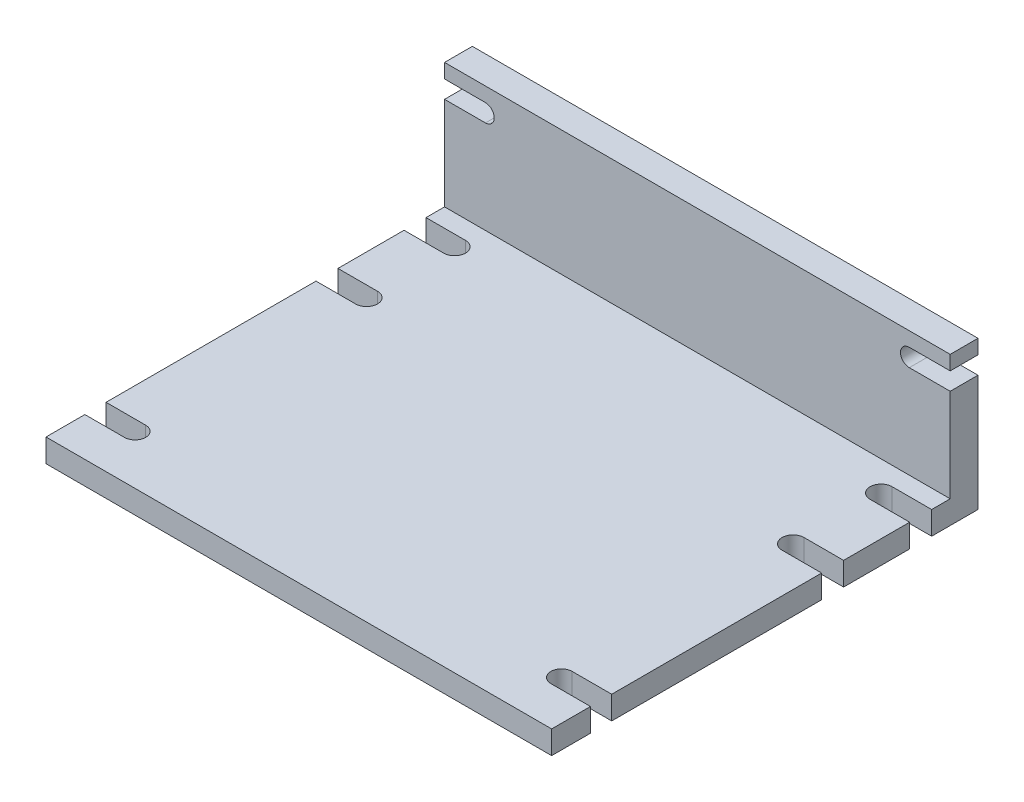
ISO-10303-21;
HEADER;
FILE_DESCRIPTION(('STEP AP214'),'2;1');
FILE_NAME('part.step','',(''),(''),'','','');
FILE_SCHEMA(('AUTOMOTIVE_DESIGN { 1 0 10303 214 1 1 1 1 }'));
ENDSEC;
DATA;
#1=APPLICATION_CONTEXT('core data for automotive mechanical design processes');
#2=APPLICATION_PROTOCOL_DEFINITION('international standard','automotive_design',2000,#1);
#3=PRODUCT_CONTEXT('',#1,'mechanical');
#4=PRODUCT('Part','Part','',(#3));
#5=PRODUCT_RELATED_PRODUCT_CATEGORY('part','',(#4));
#6=PRODUCT_DEFINITION_FORMATION('','',#4);
#7=PRODUCT_DEFINITION_CONTEXT('part definition',#1,'design');
#8=PRODUCT_DEFINITION('design','',#6,#7);
#9=PRODUCT_DEFINITION_SHAPE('','',#8);
#10=(LENGTH_UNIT() NAMED_UNIT(*) SI_UNIT(.MILLI.,.METRE.));
#11=(NAMED_UNIT(*) PLANE_ANGLE_UNIT() SI_UNIT($,.RADIAN.));
#12=(NAMED_UNIT(*) SI_UNIT($,.STERADIAN.) SOLID_ANGLE_UNIT());
#13=UNCERTAINTY_MEASURE_WITH_UNIT(LENGTH_MEASURE(1.E-05),#10,'distance_accuracy_value','');
#14=(GEOMETRIC_REPRESENTATION_CONTEXT(3) GLOBAL_UNCERTAINTY_ASSIGNED_CONTEXT((#13)) GLOBAL_UNIT_ASSIGNED_CONTEXT((#10,
#11,#12)) REPRESENTATION_CONTEXT('',''));
#15=CARTESIAN_POINT('',(0.,0.,0.));
#16=DIRECTION('',(0.,0.,1.));
#17=DIRECTION('',(1.,0.,0.));
#18=AXIS2_PLACEMENT_3D('',#15,#16,#17);
#19=CARTESIAN_POINT('',(-54.555,32.,46.));
#20=DIRECTION('',(1.,0.,0.));
#21=DIRECTION('',(0.,0.,-1.));
#22=AXIS2_PLACEMENT_3D('',#19,#20,#21);
#23=PLANE('',#22);
#24=DIRECTION('',(0.,0.,-1.));
#25=VECTOR('',#24,1.);
#26=CARTESIAN_POINT('',(-54.555,5.,46.));
#27=LINE('',#26,#25);
#28=CARTESIAN_POINT('',(-54.555,5.,46.));
#29=VERTEX_POINT('',#28);
#30=CARTESIAN_POINT('',(-54.555,5.,37.6156076465675));
#31=VERTEX_POINT('',#30);
#32=EDGE_CURVE('E499',#29,#31,#27,.T.);
#33=ORIENTED_EDGE('',*,*,#32,.T.);
#34=DIRECTION('',(0.,1.,0.));
#35=VECTOR('',#34,1.);
#36=CARTESIAN_POINT('',(-54.555,0.,37.6156076465675));
#37=LINE('',#36,#35);
#38=CARTESIAN_POINT('',(-54.555,0.,37.6156076465675));
#39=VERTEX_POINT('',#38);
#40=EDGE_CURVE('E329',#39,#31,#37,.T.);
#41=ORIENTED_EDGE('',*,*,#40,.F.);
#42=DIRECTION('',(0.,0.,1.));
#43=VECTOR('',#42,1.);
#44=CARTESIAN_POINT('',(-54.555,0.,46.));
#45=LINE('',#44,#43);
#46=CARTESIAN_POINT('',(-54.555,0.,46.));
#47=VERTEX_POINT('',#46);
#48=EDGE_CURVE('E520',#39,#47,#45,.T.);
#49=ORIENTED_EDGE('',*,*,#48,.T.);
#50=DIRECTION('',(0.,-1.,0.));
#51=VECTOR('',#50,1.);
#52=CARTESIAN_POINT('',(-54.555,32.,46.));
#53=LINE('',#52,#51);
#54=EDGE_CURVE('E11',#29,#47,#53,.T.);
#55=ORIENTED_EDGE('',*,*,#54,.F.);
#56=EDGE_LOOP('',(#33,#41,#49,#55));
#57=FACE_BOUND('',#56,.T.);
#58=ADVANCED_FACE('F41',(#57),#23,.F.);
#59=CARTESIAN_POINT('',(-54.555,0.,-12.26));
#60=VERTEX_POINT('',#59);
#61=CARTESIAN_POINT('',(-54.555,0.,33.0378617913331));
#62=VERTEX_POINT('',#61);
#63=EDGE_CURVE('E576',#60,#62,#45,.T.);
#64=ORIENTED_EDGE('',*,*,#63,.T.);
#65=DIRECTION('',(0.,1.,0.));
#66=VECTOR('',#65,1.);
#67=CARTESIAN_POINT('',(-54.555,0.,33.0378617913331));
#68=LINE('',#67,#66);
#69=CARTESIAN_POINT('',(-54.555,5.,33.0378617913331));
#70=VERTEX_POINT('',#69);
#71=EDGE_CURVE('E326',#62,#70,#68,.T.);
#72=ORIENTED_EDGE('',*,*,#71,.T.);
#73=CARTESIAN_POINT('',(-54.555,5.,-12.26));
#74=VERTEX_POINT('',#73);
#75=EDGE_CURVE('E503',#70,#74,#27,.T.);
#76=ORIENTED_EDGE('',*,*,#75,.T.);
#77=DIRECTION('',(0.,1.,0.));
#78=VECTOR('',#77,1.);
#79=CARTESIAN_POINT('',(-54.555,0.,-12.26));
#80=LINE('',#79,#78);
#81=EDGE_CURVE('E295',#60,#74,#80,.T.);
#82=ORIENTED_EDGE('',*,*,#81,.F.);
#83=EDGE_LOOP('',(#64,#72,#76,#82));
#84=FACE_BOUND('',#83,.T.);
#85=ADVANCED_FACE('F606',(#84),#23,.F.);
#86=CARTESIAN_POINT('',(-54.555,0.,-31.26));
#87=VERTEX_POINT('',#86);
#88=CARTESIAN_POINT('',(-54.555,0.,-17.));
#89=VERTEX_POINT('',#88);
#90=EDGE_CURVE('E538',#87,#89,#45,.T.);
#91=ORIENTED_EDGE('',*,*,#90,.T.);
#92=DIRECTION('',(0.,1.,0.));
#93=VECTOR('',#92,1.);
#94=CARTESIAN_POINT('',(-54.555,0.,-17.));
#95=LINE('',#94,#93);
#96=CARTESIAN_POINT('',(-54.555,5.,-17.));
#97=VERTEX_POINT('',#96);
#98=EDGE_CURVE('E587',#89,#97,#95,.T.);
#99=ORIENTED_EDGE('',*,*,#98,.T.);
#100=CARTESIAN_POINT('',(-54.555,5.,-31.26));
#101=VERTEX_POINT('',#100);
#102=EDGE_CURVE('E902',#97,#101,#27,.T.);
#103=ORIENTED_EDGE('',*,*,#102,.T.);
#104=DIRECTION('',(0.,1.,0.));
#105=VECTOR('',#104,1.);
#106=CARTESIAN_POINT('',(-54.555,0.,-31.26));
#107=LINE('',#106,#105);
#108=EDGE_CURVE('E440',#87,#101,#107,.T.);
#109=ORIENTED_EDGE('',*,*,#108,.F.);
#110=EDGE_LOOP('',(#91,#99,#103,#109));
#111=FACE_BOUND('',#110,.T.);
#112=ADVANCED_FACE('F585',(#111),#23,.F.);
#113=CARTESIAN_POINT('',(54.555,32.,46.));
#114=DIRECTION('',(-1.,0.,0.));
#115=DIRECTION('',(0.,0.,1.));
#116=AXIS2_PLACEMENT_3D('',#113,#114,#115);
#117=PLANE('',#116);
#118=DIRECTION('',(0.,0.,-1.));
#119=VECTOR('',#118,1.);
#120=CARTESIAN_POINT('',(54.555,0.,46.));
#121=LINE('',#120,#119);
#122=CARTESIAN_POINT('',(54.555,0.,-17.));
#123=VERTEX_POINT('',#122);
#124=CARTESIAN_POINT('',(54.555,0.,-31.26));
#125=VERTEX_POINT('',#124);
#126=EDGE_CURVE('E654',#123,#125,#121,.T.);
#127=ORIENTED_EDGE('',*,*,#126,.T.);
#128=DIRECTION('',(0.,1.,0.));
#129=VECTOR('',#128,1.);
#130=CARTESIAN_POINT('',(54.555,0.,-31.26));
#131=LINE('',#130,#129);
#132=CARTESIAN_POINT('',(54.555,5.,-31.26));
#133=VERTEX_POINT('',#132);
#134=EDGE_CURVE('E405',#125,#133,#131,.T.);
#135=ORIENTED_EDGE('',*,*,#134,.T.);
#136=DIRECTION('',(0.,0.,-1.));
#137=VECTOR('',#136,1.);
#138=CARTESIAN_POINT('',(54.555,5.,46.));
#139=LINE('',#138,#137);
#140=CARTESIAN_POINT('',(54.555,5.,-17.));
#141=VERTEX_POINT('',#140);
#142=EDGE_CURVE('E708',#141,#133,#139,.T.);
#143=ORIENTED_EDGE('',*,*,#142,.F.);
#144=DIRECTION('',(0.,1.,0.));
#145=VECTOR('',#144,1.);
#146=CARTESIAN_POINT('',(54.555,0.,-17.));
#147=LINE('',#146,#145);
#148=EDGE_CURVE('E381',#123,#141,#147,.T.);
#149=ORIENTED_EDGE('',*,*,#148,.F.);
#150=EDGE_LOOP('',(#127,#135,#143,#149));
#151=FACE_BOUND('',#150,.T.);
#152=ADVANCED_FACE('F631',(#151),#117,.F.);
#153=CARTESIAN_POINT('',(54.555,5.,-36.));
#154=VERTEX_POINT('',#153);
#155=CARTESIAN_POINT('',(54.555,5.,-40.));
#156=VERTEX_POINT('',#155);
#157=EDGE_CURVE('E467',#154,#156,#139,.T.);
#158=ORIENTED_EDGE('',*,*,#157,.F.);
#159=DIRECTION('',(0.,1.,0.));
#160=VECTOR('',#159,1.);
#161=CARTESIAN_POINT('',(54.555,0.,-36.));
#162=LINE('',#161,#160);
#163=CARTESIAN_POINT('',(54.555,0.,-36.));
#164=VERTEX_POINT('',#163);
#165=EDGE_CURVE('E398',#164,#154,#162,.T.);
#166=ORIENTED_EDGE('',*,*,#165,.F.);
#167=CARTESIAN_POINT('',(54.555,0.,-46.));
#168=VERTEX_POINT('',#167);
#169=EDGE_CURVE('E541',#164,#168,#121,.T.);
#170=ORIENTED_EDGE('',*,*,#169,.T.);
#171=DIRECTION('',(0.,-1.,0.));
#172=VECTOR('',#171,1.);
#173=CARTESIAN_POINT('',(54.555,32.,-46.));
#174=LINE('',#173,#172);
#175=CARTESIAN_POINT('',(54.555,25.1,-46.));
#176=VERTEX_POINT('',#175);
#177=EDGE_CURVE('E551',#176,#168,#174,.T.);
#178=ORIENTED_EDGE('',*,*,#177,.F.);
#179=DIRECTION('',(0.,0.,1.));
#180=VECTOR('',#179,1.);
#181=CARTESIAN_POINT('',(54.555,25.1,-46.));
#182=LINE('',#181,#180);
#183=CARTESIAN_POINT('',(54.555,25.1,-40.));
#184=VERTEX_POINT('',#183);
#185=EDGE_CURVE('E470',#176,#184,#182,.T.);
#186=ORIENTED_EDGE('',*,*,#185,.T.);
#187=DIRECTION('',(0.,1.,0.));
#188=VECTOR('',#187,1.);
#189=CARTESIAN_POINT('',(54.555,32.,-40.));
#190=LINE('',#189,#188);
#191=EDGE_CURVE('E514',#156,#184,#190,.T.);
#192=ORIENTED_EDGE('',*,*,#191,.F.);
#193=EDGE_LOOP('',(#158,#166,#170,#178,#186,#192));
#194=FACE_BOUND('',#193,.T.);
#195=ADVANCED_FACE('F629',(#194),#117,.F.);
#196=CARTESIAN_POINT('',(54.555,0.,46.));
#197=VERTEX_POINT('',#196);
#198=CARTESIAN_POINT('',(54.555,0.,37.6156076465675));
#199=VERTEX_POINT('',#198);
#200=EDGE_CURVE('E542',#197,#199,#121,.T.);
#201=ORIENTED_EDGE('',*,*,#200,.T.);
#202=DIRECTION('',(0.,1.,0.));
#203=VECTOR('',#202,1.);
#204=CARTESIAN_POINT('',(54.555,0.,37.6156076465675));
#205=LINE('',#204,#203);
#206=CARTESIAN_POINT('',(54.555,5.,37.6156076465675));
#207=VERTEX_POINT('',#206);
#208=EDGE_CURVE('E355',#199,#207,#205,.T.);
#209=ORIENTED_EDGE('',*,*,#208,.T.);
#210=CARTESIAN_POINT('',(54.555,5.,46.));
#211=VERTEX_POINT('',#210);
#212=EDGE_CURVE('E509',#211,#207,#139,.T.);
#213=ORIENTED_EDGE('',*,*,#212,.F.);
#214=DIRECTION('',(0.,-1.,0.));
#215=VECTOR('',#214,1.);
#216=CARTESIAN_POINT('',(54.555,32.,46.));
#217=LINE('',#216,#215);
#218=EDGE_CURVE('E49',#211,#197,#217,.T.);
#219=ORIENTED_EDGE('',*,*,#218,.T.);
#220=EDGE_LOOP('',(#201,#209,#213,#219));
#221=FACE_BOUND('',#220,.T.);
#222=ADVANCED_FACE('F557',(#221),#117,.F.);
#223=CARTESIAN_POINT('',(-54.555,0.,-46.));
#224=VERTEX_POINT('',#223);
#225=CARTESIAN_POINT('',(-54.555,0.,-36.));
#226=VERTEX_POINT('',#225);
#227=EDGE_CURVE('E534',#224,#226,#45,.T.);
#228=ORIENTED_EDGE('',*,*,#227,.T.);
#229=DIRECTION('',(0.,1.,0.));
#230=VECTOR('',#229,1.);
#231=CARTESIAN_POINT('',(-54.555,0.,-36.));
#232=LINE('',#231,#230);
#233=CARTESIAN_POINT('',(-54.555,5.,-36.));
#234=VERTEX_POINT('',#233);
#235=EDGE_CURVE('E442',#226,#234,#232,.T.);
#236=ORIENTED_EDGE('',*,*,#235,.T.);
#237=CARTESIAN_POINT('',(-54.555,5.,-40.));
#238=VERTEX_POINT('',#237);
#239=EDGE_CURVE('E504',#234,#238,#27,.T.);
#240=ORIENTED_EDGE('',*,*,#239,.T.);
#241=DIRECTION('',(0.,1.,0.));
#242=VECTOR('',#241,1.);
#243=CARTESIAN_POINT('',(-54.555,32.,-40.));
#244=LINE('',#243,#242);
#245=CARTESIAN_POINT('',(-54.555,25.1,-40.));
#246=VERTEX_POINT('',#245);
#247=EDGE_CURVE('E505',#238,#246,#244,.T.);
#248=ORIENTED_EDGE('',*,*,#247,.T.);
#249=DIRECTION('',(0.,0.,1.));
#250=VECTOR('',#249,1.);
#251=CARTESIAN_POINT('',(-54.555,25.1,-46.));
#252=LINE('',#251,#250);
#253=CARTESIAN_POINT('',(-54.555,25.1,-46.));
#254=VERTEX_POINT('',#253);
#255=EDGE_CURVE('E482',#254,#246,#252,.T.);
#256=ORIENTED_EDGE('',*,*,#255,.F.);
#257=DIRECTION('',(0.,-1.,0.));
#258=VECTOR('',#257,1.);
#259=CARTESIAN_POINT('',(-54.555,32.,-46.));
#260=LINE('',#259,#258);
#261=EDGE_CURVE('E533',#254,#224,#260,.T.);
#262=ORIENTED_EDGE('',*,*,#261,.T.);
#263=EDGE_LOOP('',(#228,#236,#240,#248,#256,#262));
#264=FACE_BOUND('',#263,.T.);
#265=ADVANCED_FACE('F614',(#264),#23,.F.);
#266=CARTESIAN_POINT('',(54.555,28.9,-40.));
#267=VERTEX_POINT('',#266);
#268=CARTESIAN_POINT('',(54.555,32.,-40.));
#269=VERTEX_POINT('',#268);
#270=EDGE_CURVE('E512',#267,#269,#190,.T.);
#271=ORIENTED_EDGE('',*,*,#270,.F.);
#272=DIRECTION('',(0.,0.,1.));
#273=VECTOR('',#272,1.);
#274=CARTESIAN_POINT('',(54.555,28.9,-46.));
#275=LINE('',#274,#273);
#276=CARTESIAN_POINT('',(54.555,28.9,-46.));
#277=VERTEX_POINT('',#276);
#278=EDGE_CURVE('E468',#277,#267,#275,.T.);
#279=ORIENTED_EDGE('',*,*,#278,.F.);
#280=CARTESIAN_POINT('',(54.555,32.,-46.));
#281=VERTEX_POINT('',#280);
#282=EDGE_CURVE('E552',#281,#277,#174,.T.);
#283=ORIENTED_EDGE('',*,*,#282,.F.);
#284=DIRECTION('',(0.,0.,-1.));
#285=VECTOR('',#284,1.);
#286=CARTESIAN_POINT('',(54.555,32.,46.));
#287=LINE('',#286,#285);
#288=EDGE_CURVE('E528',#269,#281,#287,.T.);
#289=ORIENTED_EDGE('',*,*,#288,.F.);
#290=EDGE_LOOP('',(#271,#279,#283,#289));
#291=FACE_BOUND('',#290,.T.);
#292=ADVANCED_FACE('F612',(#291),#117,.F.);
#293=CARTESIAN_POINT('',(-54.555,32.,-46.));
#294=VERTEX_POINT('',#293);
#295=CARTESIAN_POINT('',(-54.555,28.9,-46.));
#296=VERTEX_POINT('',#295);
#297=EDGE_CURVE('E548',#294,#296,#260,.T.);
#298=ORIENTED_EDGE('',*,*,#297,.T.);
#299=DIRECTION('',(0.,0.,1.));
#300=VECTOR('',#299,1.);
#301=CARTESIAN_POINT('',(-54.555,28.9,-46.));
#302=LINE('',#301,#300);
#303=CARTESIAN_POINT('',(-54.555,28.9,-40.));
#304=VERTEX_POINT('',#303);
#305=EDGE_CURVE('E479',#296,#304,#302,.T.);
#306=ORIENTED_EDGE('',*,*,#305,.T.);
#307=CARTESIAN_POINT('',(-54.555,32.,-40.));
#308=VERTEX_POINT('',#307);
#309=EDGE_CURVE('E502',#304,#308,#244,.T.);
#310=ORIENTED_EDGE('',*,*,#309,.T.);
#311=DIRECTION('',(0.,0.,1.));
#312=VECTOR('',#311,1.);
#313=CARTESIAN_POINT('',(-54.555,32.,46.));
#314=LINE('',#313,#312);
#315=EDGE_CURVE('E525',#294,#308,#314,.T.);
#316=ORIENTED_EDGE('',*,*,#315,.F.);
#317=EDGE_LOOP('',(#298,#306,#310,#316));
#318=FACE_BOUND('',#317,.T.);
#319=ADVANCED_FACE('F43',(#318),#23,.F.);
#320=CARTESIAN_POINT('',(54.555,32.,46.));
#321=DIRECTION('',(0.,0.,-1.));
#322=DIRECTION('',(-1.,0.,0.));
#323=AXIS2_PLACEMENT_3D('',#320,#321,#322);
#324=PLANE('',#323);
#325=ORIENTED_EDGE('',*,*,#218,.F.);
#326=DIRECTION('',(1.,0.,0.));
#327=VECTOR('',#326,1.);
#328=CARTESIAN_POINT('',(-54.555,5.,46.));
#329=LINE('',#328,#327);
#330=EDGE_CURVE('E508',#29,#211,#329,.T.);
#331=ORIENTED_EDGE('',*,*,#330,.F.);
#332=ORIENTED_EDGE('',*,*,#54,.T.);
#333=DIRECTION('',(1.,0.,0.));
#334=VECTOR('',#333,1.);
#335=CARTESIAN_POINT('',(54.555,0.,46.));
#336=LINE('',#335,#334);
#337=EDGE_CURVE('E537',#47,#197,#336,.T.);
#338=ORIENTED_EDGE('',*,*,#337,.T.);
#339=EDGE_LOOP('',(#325,#331,#332,#338));
#340=FACE_BOUND('',#339,.T.);
#341=ADVANCED_FACE('F562',(#340),#324,.F.);
#342=CARTESIAN_POINT('',(54.555,0.,33.0378617913331));
#343=VERTEX_POINT('',#342);
#344=CARTESIAN_POINT('',(54.555,0.,-12.26));
#345=VERTEX_POINT('',#344);
#346=EDGE_CURVE('E545',#343,#345,#121,.T.);
#347=ORIENTED_EDGE('',*,*,#346,.T.);
#348=DIRECTION('',(0.,1.,0.));
#349=VECTOR('',#348,1.);
#350=CARTESIAN_POINT('',(54.555,0.,-12.26));
#351=LINE('',#350,#349);
#352=CARTESIAN_POINT('',(54.555,5.,-12.26));
#353=VERTEX_POINT('',#352);
#354=EDGE_CURVE('E378',#345,#353,#351,.T.);
#355=ORIENTED_EDGE('',*,*,#354,.T.);
#356=CARTESIAN_POINT('',(54.555,5.,33.0378617913331));
#357=VERTEX_POINT('',#356);
#358=EDGE_CURVE('E513',#357,#353,#139,.T.);
#359=ORIENTED_EDGE('',*,*,#358,.F.);
#360=DIRECTION('',(0.,1.,0.));
#361=VECTOR('',#360,1.);
#362=CARTESIAN_POINT('',(54.555,0.,33.0378617913331));
#363=LINE('',#362,#361);
#364=EDGE_CURVE('E348',#343,#357,#363,.T.);
#365=ORIENTED_EDGE('',*,*,#364,.F.);
#366=EDGE_LOOP('',(#347,#355,#359,#365));
#367=FACE_BOUND('',#366,.T.);
#368=ADVANCED_FACE('F620',(#367),#117,.F.);
#369=CARTESIAN_POINT('',(54.555,32.,-46.));
#370=DIRECTION('',(0.,0.,1.));
#371=DIRECTION('',(1.,0.,0.));
#372=AXIS2_PLACEMENT_3D('',#369,#370,#371);
#373=PLANE('',#372);
#374=ORIENTED_EDGE('',*,*,#282,.T.);
#375=DIRECTION('',(-1.,0.,0.));
#376=VECTOR('',#375,1.);
#377=CARTESIAN_POINT('',(45.735,28.9,-46.));
#378=LINE('',#377,#376);
#379=CARTESIAN_POINT('',(45.735,28.9,-46.));
#380=VERTEX_POINT('',#379);
#381=EDGE_CURVE('E454',#277,#380,#378,.T.);
#382=ORIENTED_EDGE('',*,*,#381,.T.);
#383=CARTESIAN_POINT('',(45.735,27.,-46.));
#384=DIRECTION('',(0.,0.,1.));
#385=DIRECTION('',(1.,0.,0.));
#386=AXIS2_PLACEMENT_3D('',#383,#384,#385);
#387=CIRCLE('',#386,1.9);
#388=CARTESIAN_POINT('',(45.735,25.1,-46.));
#389=VERTEX_POINT('',#388);
#390=EDGE_CURVE('E447',#380,#389,#387,.T.);
#391=ORIENTED_EDGE('',*,*,#390,.T.);
#392=DIRECTION('',(1.,0.,0.));
#393=VECTOR('',#392,1.);
#394=CARTESIAN_POINT('',(54.555,25.1,-46.));
#395=LINE('',#394,#393);
#396=EDGE_CURVE('E450',#389,#176,#395,.T.);
#397=ORIENTED_EDGE('',*,*,#396,.T.);
#398=ORIENTED_EDGE('',*,*,#177,.T.);
#399=DIRECTION('',(-1.,0.,0.));
#400=VECTOR('',#399,1.);
#401=CARTESIAN_POINT('',(54.555,0.,-46.));
#402=LINE('',#401,#400);
#403=EDGE_CURVE('E529',#168,#224,#402,.T.);
#404=ORIENTED_EDGE('',*,*,#403,.T.);
#405=ORIENTED_EDGE('',*,*,#261,.F.);
#406=DIRECTION('',(1.,0.,0.));
#407=VECTOR('',#406,1.);
#408=CARTESIAN_POINT('',(-54.555,25.1,-46.));
#409=LINE('',#408,#407);
#410=CARTESIAN_POINT('',(-45.735,25.1,-46.));
#411=VERTEX_POINT('',#410);
#412=EDGE_CURVE('E478',#254,#411,#409,.T.);
#413=ORIENTED_EDGE('',*,*,#412,.T.);
#414=CARTESIAN_POINT('',(-45.735,27.,-46.));
#415=DIRECTION('',(0.,0.,1.));
#416=DIRECTION('',(-1.,0.,0.));
#417=AXIS2_PLACEMENT_3D('',#414,#415,#416);
#418=CIRCLE('',#417,1.9);
#419=CARTESIAN_POINT('',(-45.735,28.9,-46.));
#420=VERTEX_POINT('',#419);
#421=EDGE_CURVE('E489',#411,#420,#418,.T.);
#422=ORIENTED_EDGE('',*,*,#421,.T.);
#423=DIRECTION('',(-1.,0.,0.));
#424=VECTOR('',#423,1.);
#425=CARTESIAN_POINT('',(-45.735,28.9,-46.));
#426=LINE('',#425,#424);
#427=EDGE_CURVE('E494',#420,#296,#426,.T.);
#428=ORIENTED_EDGE('',*,*,#427,.T.);
#429=ORIENTED_EDGE('',*,*,#297,.F.);
#430=DIRECTION('',(-1.,0.,0.));
#431=VECTOR('',#430,1.);
#432=CARTESIAN_POINT('',(54.555,32.,-46.));
#433=LINE('',#432,#431);
#434=EDGE_CURVE('E531',#281,#294,#433,.T.);
#435=ORIENTED_EDGE('',*,*,#434,.F.);
#436=EDGE_LOOP('',(#374,#382,#391,#397,#398,#404,#405,#413,#422,#428,#429,#435));
#437=FACE_BOUND('',#436,.T.);
#438=ADVANCED_FACE('F642',(#437),#373,.F.);
#439=CARTESIAN_POINT('',(0.,32.,0.));
#440=DIRECTION('',(0.,1.,0.));
#441=DIRECTION('',(0.,0.,1.));
#442=AXIS2_PLACEMENT_3D('',#439,#440,#441);
#443=PLANE('',#442);
#444=DIRECTION('',(1.,0.,0.));
#445=VECTOR('',#444,1.);
#446=CARTESIAN_POINT('',(-54.555,32.,-40.));
#447=LINE('',#446,#445);
#448=EDGE_CURVE('E517',#308,#269,#447,.T.);
#449=ORIENTED_EDGE('',*,*,#448,.T.);
#450=ORIENTED_EDGE('',*,*,#288,.T.);
#451=ORIENTED_EDGE('',*,*,#434,.T.);
#452=ORIENTED_EDGE('',*,*,#315,.T.);
#453=EDGE_LOOP('',(#449,#450,#451,#452));
#454=FACE_BOUND('',#453,.T.);
#455=ADVANCED_FACE('F647',(#454),#443,.T.);
#456=CARTESIAN_POINT('',(0.,0.,0.));
#457=DIRECTION('',(0.,1.,0.));
#458=DIRECTION('',(0.,0.,1.));
#459=AXIS2_PLACEMENT_3D('',#456,#457,#458);
#460=PLANE('',#459);
#461=CARTESIAN_POINT('',(46.015,0.,-33.63));
#462=DIRECTION('',(0.,1.,0.));
#463=DIRECTION('',(0.,0.,-1.));
#464=AXIS2_PLACEMENT_3D('',#461,#462,#463);
#465=CIRCLE('',#464,2.37);
#466=CARTESIAN_POINT('',(46.015,0.,-36.));
#467=VERTEX_POINT('',#466);
#468=CARTESIAN_POINT('',(46.015,0.,-31.26));
#469=VERTEX_POINT('',#468);
#470=EDGE_CURVE('E418',#467,#469,#465,.T.);
#471=ORIENTED_EDGE('',*,*,#470,.T.);
#472=DIRECTION('',(1.,0.,0.));
#473=VECTOR('',#472,1.);
#474=CARTESIAN_POINT('',(54.555,0.,-31.26));
#475=LINE('',#474,#473);
#476=EDGE_CURVE('E400',#469,#125,#475,.T.);
#477=ORIENTED_EDGE('',*,*,#476,.T.);
#478=ORIENTED_EDGE('',*,*,#126,.F.);
#479=DIRECTION('',(-1.,0.,0.));
#480=VECTOR('',#479,1.);
#481=CARTESIAN_POINT('',(46.015,0.,-17.));
#482=LINE('',#481,#480);
#483=CARTESIAN_POINT('',(46.015,0.,-17.));
#484=VERTEX_POINT('',#483);
#485=EDGE_CURVE('E387',#123,#484,#482,.T.);
#486=ORIENTED_EDGE('',*,*,#485,.T.);
#487=CARTESIAN_POINT('',(46.015,0.,-14.63));
#488=DIRECTION('',(0.,1.,0.));
#489=DIRECTION('',(0.,0.,-1.));
#490=AXIS2_PLACEMENT_3D('',#487,#488,#489);
#491=CIRCLE('',#490,2.37);
#492=CARTESIAN_POINT('',(46.015,0.,-12.26));
#493=VERTEX_POINT('',#492);
#494=EDGE_CURVE('E393',#484,#493,#491,.T.);
#495=ORIENTED_EDGE('',*,*,#494,.T.);
#496=DIRECTION('',(1.,0.,0.));
#497=VECTOR('',#496,1.);
#498=CARTESIAN_POINT('',(54.555,0.,-12.26));
#499=LINE('',#498,#497);
#500=EDGE_CURVE('E375',#493,#345,#499,.T.);
#501=ORIENTED_EDGE('',*,*,#500,.T.);
#502=ORIENTED_EDGE('',*,*,#346,.F.);
#503=DIRECTION('',(-1.,0.,0.));
#504=VECTOR('',#503,1.);
#505=CARTESIAN_POINT('',(46.015,0.,33.0378617913331));
#506=LINE('',#505,#504);
#507=CARTESIAN_POINT('',(46.015,0.,33.0378617913331));
#508=VERTEX_POINT('',#507);
#509=EDGE_CURVE('E361',#343,#508,#506,.T.);
#510=ORIENTED_EDGE('',*,*,#509,.T.);
#511=CARTESIAN_POINT('',(46.015,0.,35.3267347189503));
#512=DIRECTION('',(0.,1.,0.));
#513=DIRECTION('',(0.,0.,-1.));
#514=AXIS2_PLACEMENT_3D('',#511,#512,#513);
#515=CIRCLE('',#514,2.28887292761718);
#516=CARTESIAN_POINT('',(46.015,0.,37.6156076465675));
#517=VERTEX_POINT('',#516);
#518=EDGE_CURVE('E368',#508,#517,#515,.T.);
#519=ORIENTED_EDGE('',*,*,#518,.T.);
#520=DIRECTION('',(1.,0.,0.));
#521=VECTOR('',#520,1.);
#522=CARTESIAN_POINT('',(54.555,0.,37.6156076465675));
#523=LINE('',#522,#521);
#524=EDGE_CURVE('E350',#517,#199,#523,.T.);
#525=ORIENTED_EDGE('',*,*,#524,.T.);
#526=ORIENTED_EDGE('',*,*,#200,.F.);
#527=ORIENTED_EDGE('',*,*,#337,.F.);
#528=ORIENTED_EDGE('',*,*,#48,.F.);
#529=DIRECTION('',(1.,0.,0.));
#530=VECTOR('',#529,1.);
#531=CARTESIAN_POINT('',(-54.555,0.,37.6156076465675));
#532=LINE('',#531,#530);
#533=CARTESIAN_POINT('',(-46.015,0.,37.6156076465675));
#534=VERTEX_POINT('',#533);
#535=EDGE_CURVE('E325',#39,#534,#532,.T.);
#536=ORIENTED_EDGE('',*,*,#535,.T.);
#537=CARTESIAN_POINT('',(-46.015,0.,35.3267347189503));
#538=DIRECTION('',(0.,1.,0.));
#539=DIRECTION('',(0.,0.,1.));
#540=AXIS2_PLACEMENT_3D('',#537,#538,#539);
#541=CIRCLE('',#540,2.28887292761718);
#542=CARTESIAN_POINT('',(-46.015,0.,33.0378617913331));
#543=VERTEX_POINT('',#542);
#544=EDGE_CURVE('E338',#534,#543,#541,.T.);
#545=ORIENTED_EDGE('',*,*,#544,.T.);
#546=DIRECTION('',(-1.,0.,0.));
#547=VECTOR('',#546,1.);
#548=CARTESIAN_POINT('',(-46.015,0.,33.0378617913331));
#549=LINE('',#548,#547);
#550=EDGE_CURVE('E343',#543,#62,#549,.T.);
#551=ORIENTED_EDGE('',*,*,#550,.T.);
#552=ORIENTED_EDGE('',*,*,#63,.F.);
#553=DIRECTION('',(1.,0.,0.));
#554=VECTOR('',#553,1.);
#555=CARTESIAN_POINT('',(-54.555,0.,-12.26));
#556=LINE('',#555,#554);
#557=CARTESIAN_POINT('',(-46.015,0.,-12.26));
#558=VERTEX_POINT('',#557);
#559=EDGE_CURVE('E316',#60,#558,#556,.T.);
#560=ORIENTED_EDGE('',*,*,#559,.T.);
#561=CARTESIAN_POINT('',(-46.015,0.,-14.63));
#562=DIRECTION('',(0.,1.,0.));
#563=DIRECTION('',(0.,0.,1.));
#564=AXIS2_PLACEMENT_3D('',#561,#562,#563);
#565=CIRCLE('',#564,2.37);
#566=CARTESIAN_POINT('',(-46.015,0.,-17.));
#567=VERTEX_POINT('',#566);
#568=EDGE_CURVE('E292',#558,#567,#565,.T.);
#569=ORIENTED_EDGE('',*,*,#568,.T.);
#570=DIRECTION('',(-1.,0.,0.));
#571=VECTOR('',#570,1.);
#572=CARTESIAN_POINT('',(-46.015,0.,-17.));
#573=LINE('',#572,#571);
#574=EDGE_CURVE('E318',#567,#89,#573,.T.);
#575=ORIENTED_EDGE('',*,*,#574,.T.);
#576=ORIENTED_EDGE('',*,*,#90,.F.);
#577=DIRECTION('',(1.,0.,0.));
#578=VECTOR('',#577,1.);
#579=CARTESIAN_POINT('',(-54.555,0.,-31.26));
#580=LINE('',#579,#578);
#581=CARTESIAN_POINT('',(-46.015,0.,-31.26));
#582=VERTEX_POINT('',#581);
#583=EDGE_CURVE('E430',#87,#582,#580,.T.);
#584=ORIENTED_EDGE('',*,*,#583,.T.);
#585=CARTESIAN_POINT('',(-46.015,0.,-33.63));
#586=DIRECTION('',(0.,1.,0.));
#587=DIRECTION('',(0.,0.,1.));
#588=AXIS2_PLACEMENT_3D('',#585,#586,#587);
#589=CIRCLE('',#588,2.37);
#590=CARTESIAN_POINT('',(-46.015,0.,-36.));
#591=VERTEX_POINT('',#590);
#592=EDGE_CURVE('E423',#582,#591,#589,.T.);
#593=ORIENTED_EDGE('',*,*,#592,.T.);
#594=DIRECTION('',(-1.,0.,0.));
#595=VECTOR('',#594,1.);
#596=CARTESIAN_POINT('',(-46.015,0.,-36.));
#597=LINE('',#596,#595);
#598=EDGE_CURVE('E426',#591,#226,#597,.T.);
#599=ORIENTED_EDGE('',*,*,#598,.T.);
#600=ORIENTED_EDGE('',*,*,#227,.F.);
#601=ORIENTED_EDGE('',*,*,#403,.F.);
#602=ORIENTED_EDGE('',*,*,#169,.F.);
#603=DIRECTION('',(-1.,0.,0.));
#604=VECTOR('',#603,1.);
#605=CARTESIAN_POINT('',(46.015,0.,-36.));
#606=LINE('',#605,#604);
#607=EDGE_CURVE('E411',#164,#467,#606,.T.);
#608=ORIENTED_EDGE('',*,*,#607,.T.);
#609=EDGE_LOOP('',(#471,#477,#478,#486,#495,#501,#502,#510,#519,#525,#526,#527,#528,#536,#545,
#551,#552,#560,#569,#575,#576,#584,#593,#599,#600,#601,#602,#608));
#610=FACE_BOUND('',#609,.T.);
#611=ADVANCED_FACE('F566',(#610),#460,.F.);
#612=CARTESIAN_POINT('',(-54.555,32.,-40.));
#613=DIRECTION('',(0.,0.,-1.));
#614=DIRECTION('',(-1.,0.,0.));
#615=AXIS2_PLACEMENT_3D('',#612,#613,#614);
#616=PLANE('',#615);
#617=CARTESIAN_POINT('',(45.735,27.,-40.));
#618=DIRECTION('',(0.,0.,1.));
#619=DIRECTION('',(1.,0.,0.));
#620=AXIS2_PLACEMENT_3D('',#617,#618,#619);
#621=CIRCLE('',#620,1.9);
#622=CARTESIAN_POINT('',(45.735,28.9,-40.));
#623=VERTEX_POINT('',#622);
#624=CARTESIAN_POINT('',(45.735,25.1,-40.));
#625=VERTEX_POINT('',#624);
#626=EDGE_CURVE('E458',#623,#625,#621,.T.);
#627=ORIENTED_EDGE('',*,*,#626,.F.);
#628=DIRECTION('',(-1.,0.,0.));
#629=VECTOR('',#628,1.);
#630=CARTESIAN_POINT('',(45.735,28.9,-40.));
#631=LINE('',#630,#629);
#632=EDGE_CURVE('E451',#267,#623,#631,.T.);
#633=ORIENTED_EDGE('',*,*,#632,.F.);
#634=ORIENTED_EDGE('',*,*,#270,.T.);
#635=ORIENTED_EDGE('',*,*,#448,.F.);
#636=ORIENTED_EDGE('',*,*,#309,.F.);
#637=DIRECTION('',(-1.,0.,0.));
#638=VECTOR('',#637,1.);
#639=CARTESIAN_POINT('',(-45.735,28.9,-40.));
#640=LINE('',#639,#638);
#641=CARTESIAN_POINT('',(-45.735,28.9,-40.));
#642=VERTEX_POINT('',#641);
#643=EDGE_CURVE('E488',#642,#304,#640,.T.);
#644=ORIENTED_EDGE('',*,*,#643,.F.);
#645=CARTESIAN_POINT('',(-45.735,27.,-40.));
#646=DIRECTION('',(0.,0.,1.));
#647=DIRECTION('',(-1.,0.,0.));
#648=AXIS2_PLACEMENT_3D('',#645,#646,#647);
#649=CIRCLE('',#648,1.9);
#650=CARTESIAN_POINT('',(-45.735,25.1,-40.));
#651=VERTEX_POINT('',#650);
#652=EDGE_CURVE('E461',#651,#642,#649,.T.);
#653=ORIENTED_EDGE('',*,*,#652,.F.);
#654=DIRECTION('',(1.,0.,0.));
#655=VECTOR('',#654,1.);
#656=CARTESIAN_POINT('',(-54.555,25.1,-40.));
#657=LINE('',#656,#655);
#658=EDGE_CURVE('E485',#246,#651,#657,.T.);
#659=ORIENTED_EDGE('',*,*,#658,.F.);
#660=ORIENTED_EDGE('',*,*,#247,.F.);
#661=DIRECTION('',(1.,0.,0.));
#662=VECTOR('',#661,1.);
#663=CARTESIAN_POINT('',(-54.555,5.,-40.));
#664=LINE('',#663,#662);
#665=EDGE_CURVE('E521',#238,#156,#664,.T.);
#666=ORIENTED_EDGE('',*,*,#665,.T.);
#667=ORIENTED_EDGE('',*,*,#191,.T.);
#668=DIRECTION('',(1.,0.,0.));
#669=VECTOR('',#668,1.);
#670=CARTESIAN_POINT('',(54.555,25.1,-40.));
#671=LINE('',#670,#669);
#672=EDGE_CURVE('E460',#625,#184,#671,.T.);
#673=ORIENTED_EDGE('',*,*,#672,.F.);
#674=EDGE_LOOP('',(#627,#633,#634,#635,#636,#644,#653,#659,#660,#666,#667,#673));
#675=FACE_BOUND('',#674,.T.);
#676=ADVANCED_FACE('F695',(#675),#616,.F.);
#677=CARTESIAN_POINT('',(-54.555,5.,46.));
#678=DIRECTION('',(0.,-1.,0.));
#679=DIRECTION('',(0.,0.,-1.));
#680=AXIS2_PLACEMENT_3D('',#677,#678,#679);
#681=PLANE('',#680);
#682=ORIENTED_EDGE('',*,*,#142,.T.);
#683=DIRECTION('',(1.,0.,0.));
#684=VECTOR('',#683,1.);
#685=CARTESIAN_POINT('',(54.555,5.,-31.26));
#686=LINE('',#685,#684);
#687=CARTESIAN_POINT('',(46.015,5.,-31.26));
#688=VERTEX_POINT('',#687);
#689=EDGE_CURVE('E408',#688,#133,#686,.T.);
#690=ORIENTED_EDGE('',*,*,#689,.F.);
#691=CARTESIAN_POINT('',(46.015,5.,-33.63));
#692=DIRECTION('',(0.,1.,0.));
#693=DIRECTION('',(0.,0.,-1.));
#694=AXIS2_PLACEMENT_3D('',#691,#692,#693);
#695=CIRCLE('',#694,2.37);
#696=CARTESIAN_POINT('',(46.015,5.,-36.));
#697=VERTEX_POINT('',#696);
#698=EDGE_CURVE('E410',#697,#688,#695,.T.);
#699=ORIENTED_EDGE('',*,*,#698,.F.);
#700=DIRECTION('',(-1.,0.,0.));
#701=VECTOR('',#700,1.);
#702=CARTESIAN_POINT('',(46.015,5.,-36.));
#703=LINE('',#702,#701);
#704=EDGE_CURVE('E383',#154,#697,#703,.T.);
#705=ORIENTED_EDGE('',*,*,#704,.F.);
#706=ORIENTED_EDGE('',*,*,#157,.T.);
#707=ORIENTED_EDGE('',*,*,#665,.F.);
#708=ORIENTED_EDGE('',*,*,#239,.F.);
#709=DIRECTION('',(-1.,0.,0.));
#710=VECTOR('',#709,1.);
#711=CARTESIAN_POINT('',(-46.015,5.,-36.));
#712=LINE('',#711,#710);
#713=CARTESIAN_POINT('',(-46.015,5.,-36.));
#714=VERTEX_POINT('',#713);
#715=EDGE_CURVE('E312',#714,#234,#712,.T.);
#716=ORIENTED_EDGE('',*,*,#715,.F.);
#717=CARTESIAN_POINT('',(-46.015,5.,-33.63));
#718=DIRECTION('',(0.,1.,0.));
#719=DIRECTION('',(0.,0.,1.));
#720=AXIS2_PLACEMENT_3D('',#717,#718,#719);
#721=CIRCLE('',#720,2.37);
#722=CARTESIAN_POINT('',(-46.015,5.,-31.26));
#723=VERTEX_POINT('',#722);
#724=EDGE_CURVE('E310',#723,#714,#721,.T.);
#725=ORIENTED_EDGE('',*,*,#724,.F.);
#726=DIRECTION('',(1.,0.,0.));
#727=VECTOR('',#726,1.);
#728=CARTESIAN_POINT('',(-54.555,5.,-31.26));
#729=LINE('',#728,#727);
#730=EDGE_CURVE('E427',#101,#723,#729,.T.);
#731=ORIENTED_EDGE('',*,*,#730,.F.);
#732=ORIENTED_EDGE('',*,*,#102,.F.);
#733=DIRECTION('',(-1.,0.,0.));
#734=VECTOR('',#733,1.);
#735=CARTESIAN_POINT('',(-46.015,5.,-17.));
#736=LINE('',#735,#734);
#737=CARTESIAN_POINT('',(-46.015,5.,-17.));
#738=VERTEX_POINT('',#737);
#739=EDGE_CURVE('E304',#738,#97,#736,.T.);
#740=ORIENTED_EDGE('',*,*,#739,.F.);
#741=CARTESIAN_POINT('',(-46.015,5.,-14.63));
#742=DIRECTION('',(0.,1.,0.));
#743=DIRECTION('',(0.,0.,1.));
#744=AXIS2_PLACEMENT_3D('',#741,#742,#743);
#745=CIRCLE('',#744,2.37);
#746=CARTESIAN_POINT('',(-46.015,5.,-12.26));
#747=VERTEX_POINT('',#746);
#748=EDGE_CURVE('E289',#747,#738,#745,.T.);
#749=ORIENTED_EDGE('',*,*,#748,.F.);
#750=DIRECTION('',(1.,0.,0.));
#751=VECTOR('',#750,1.);
#752=CARTESIAN_POINT('',(-54.555,5.,-12.26));
#753=LINE('',#752,#751);
#754=EDGE_CURVE('E298',#74,#747,#753,.T.);
#755=ORIENTED_EDGE('',*,*,#754,.F.);
#756=ORIENTED_EDGE('',*,*,#75,.F.);
#757=DIRECTION('',(-1.,0.,0.));
#758=VECTOR('',#757,1.);
#759=CARTESIAN_POINT('',(-46.015,5.,33.0378617913331));
#760=LINE('',#759,#758);
#761=CARTESIAN_POINT('',(-46.015,5.,33.0378617913331));
#762=VERTEX_POINT('',#761);
#763=EDGE_CURVE('E337',#762,#70,#760,.T.);
#764=ORIENTED_EDGE('',*,*,#763,.F.);
#765=CARTESIAN_POINT('',(-46.015,5.,35.3267347189503));
#766=DIRECTION('',(0.,1.,0.));
#767=DIRECTION('',(0.,0.,1.));
#768=AXIS2_PLACEMENT_3D('',#765,#766,#767);
#769=CIRCLE('',#768,2.28887292761718);
#770=CARTESIAN_POINT('',(-46.015,5.,37.6156076465675));
#771=VERTEX_POINT('',#770);
#772=EDGE_CURVE('E64',#771,#762,#769,.T.);
#773=ORIENTED_EDGE('',*,*,#772,.F.);
#774=DIRECTION('',(1.,0.,0.));
#775=VECTOR('',#774,1.);
#776=CARTESIAN_POINT('',(-54.555,5.,37.6156076465675));
#777=LINE('',#776,#775);
#778=EDGE_CURVE('E334',#31,#771,#777,.T.);
#779=ORIENTED_EDGE('',*,*,#778,.F.);
#780=ORIENTED_EDGE('',*,*,#32,.F.);
#781=ORIENTED_EDGE('',*,*,#330,.T.);
#782=ORIENTED_EDGE('',*,*,#212,.T.);
#783=DIRECTION('',(1.,0.,0.));
#784=VECTOR('',#783,1.);
#785=CARTESIAN_POINT('',(54.555,5.,37.6156076465675));
#786=LINE('',#785,#784);
#787=CARTESIAN_POINT('',(46.015,5.,37.6156076465675));
#788=VERTEX_POINT('',#787);
#789=EDGE_CURVE('E358',#788,#207,#786,.T.);
#790=ORIENTED_EDGE('',*,*,#789,.F.);
#791=CARTESIAN_POINT('',(46.015,5.,35.3267347189503));
#792=DIRECTION('',(0.,1.,0.));
#793=DIRECTION('',(0.,0.,-1.));
#794=AXIS2_PLACEMENT_3D('',#791,#792,#793);
#795=CIRCLE('',#794,2.28887292761718);
#796=CARTESIAN_POINT('',(46.015,5.,33.0378617913331));
#797=VERTEX_POINT('',#796);
#798=EDGE_CURVE('E360',#797,#788,#795,.T.);
#799=ORIENTED_EDGE('',*,*,#798,.F.);
#800=DIRECTION('',(-1.,0.,0.));
#801=VECTOR('',#800,1.);
#802=CARTESIAN_POINT('',(46.015,5.,33.0378617913331));
#803=LINE('',#802,#801);
#804=EDGE_CURVE('E333',#357,#797,#803,.T.);
#805=ORIENTED_EDGE('',*,*,#804,.F.);
#806=ORIENTED_EDGE('',*,*,#358,.T.);
#807=DIRECTION('',(1.,0.,0.));
#808=VECTOR('',#807,1.);
#809=CARTESIAN_POINT('',(54.555,5.,-12.26));
#810=LINE('',#809,#808);
#811=CARTESIAN_POINT('',(46.015,5.,-12.26));
#812=VERTEX_POINT('',#811);
#813=EDGE_CURVE('E384',#812,#353,#810,.T.);
#814=ORIENTED_EDGE('',*,*,#813,.F.);
#815=CARTESIAN_POINT('',(46.015,5.,-14.63));
#816=DIRECTION('',(0.,1.,0.));
#817=DIRECTION('',(0.,0.,-1.));
#818=AXIS2_PLACEMENT_3D('',#815,#816,#817);
#819=CIRCLE('',#818,2.37);
#820=CARTESIAN_POINT('',(46.015,5.,-17.));
#821=VERTEX_POINT('',#820);
#822=EDGE_CURVE('E386',#821,#812,#819,.T.);
#823=ORIENTED_EDGE('',*,*,#822,.F.);
#824=DIRECTION('',(-1.,0.,0.));
#825=VECTOR('',#824,1.);
#826=CARTESIAN_POINT('',(46.015,5.,-17.));
#827=LINE('',#826,#825);
#828=EDGE_CURVE('E56',#141,#821,#827,.T.);
#829=ORIENTED_EDGE('',*,*,#828,.F.);
#830=EDGE_LOOP('',(#682,#690,#699,#705,#706,#707,#708,#716,#725,#731,#732,#740,#749,#755,#756,
#764,#773,#779,#780,#781,#782,#790,#799,#805,#806,#814,#823,#829));
#831=FACE_BOUND('',#830,.T.);
#832=ADVANCED_FACE('F308',(#831),#681,.F.);
#833=CARTESIAN_POINT('',(-45.735,27.,-46.));
#834=DIRECTION('',(0.,0.,1.));
#835=DIRECTION('',(1.,0.,0.));
#836=AXIS2_PLACEMENT_3D('',#833,#834,#835);
#837=CYLINDRICAL_SURFACE('',#836,1.9);
#838=ORIENTED_EDGE('',*,*,#652,.T.);
#839=DIRECTION('',(0.,0.,1.));
#840=VECTOR('',#839,1.);
#841=CARTESIAN_POINT('',(-45.735,28.9,-46.));
#842=LINE('',#841,#840);
#843=EDGE_CURVE('E475',#420,#642,#842,.T.);
#844=ORIENTED_EDGE('',*,*,#843,.F.);
#845=ORIENTED_EDGE('',*,*,#421,.F.);
#846=DIRECTION('',(0.,0.,1.));
#847=VECTOR('',#846,1.);
#848=CARTESIAN_POINT('',(-45.735,25.1,-46.));
#849=LINE('',#848,#847);
#850=EDGE_CURVE('E439',#411,#651,#849,.T.);
#851=ORIENTED_EDGE('',*,*,#850,.T.);
#852=EDGE_LOOP('',(#838,#844,#845,#851));
#853=FACE_BOUND('',#852,.T.);
#854=ADVANCED_FACE('F675',(#853),#837,.F.);
#855=CARTESIAN_POINT('',(-54.555,25.1,-46.));
#856=DIRECTION('',(0.,-1.,0.));
#857=DIRECTION('',(0.,0.,-1.));
#858=AXIS2_PLACEMENT_3D('',#855,#856,#857);
#859=PLANE('',#858);
#860=ORIENTED_EDGE('',*,*,#658,.T.);
#861=ORIENTED_EDGE('',*,*,#850,.F.);
#862=ORIENTED_EDGE('',*,*,#412,.F.);
#863=ORIENTED_EDGE('',*,*,#255,.T.);
#864=EDGE_LOOP('',(#860,#861,#862,#863));
#865=FACE_BOUND('',#864,.T.);
#866=ADVANCED_FACE('F671',(#865),#859,.F.);
#867=CARTESIAN_POINT('',(-45.735,28.9,-46.));
#868=DIRECTION('',(0.,1.,0.));
#869=DIRECTION('',(0.,0.,1.));
#870=AXIS2_PLACEMENT_3D('',#867,#868,#869);
#871=PLANE('',#870);
#872=ORIENTED_EDGE('',*,*,#643,.T.);
#873=ORIENTED_EDGE('',*,*,#305,.F.);
#874=ORIENTED_EDGE('',*,*,#427,.F.);
#875=ORIENTED_EDGE('',*,*,#843,.T.);
#876=EDGE_LOOP('',(#872,#873,#874,#875));
#877=FACE_BOUND('',#876,.T.);
#878=ADVANCED_FACE('F679',(#877),#871,.F.);
#879=CARTESIAN_POINT('',(45.735,27.,-46.));
#880=DIRECTION('',(0.,0.,1.));
#881=DIRECTION('',(1.,0.,0.));
#882=AXIS2_PLACEMENT_3D('',#879,#880,#881);
#883=CYLINDRICAL_SURFACE('',#882,1.9);
#884=ORIENTED_EDGE('',*,*,#626,.T.);
#885=DIRECTION('',(0.,0.,1.));
#886=VECTOR('',#885,1.);
#887=CARTESIAN_POINT('',(45.735,25.1,-46.));
#888=LINE('',#887,#886);
#889=EDGE_CURVE('E457',#389,#625,#888,.T.);
#890=ORIENTED_EDGE('',*,*,#889,.F.);
#891=ORIENTED_EDGE('',*,*,#390,.F.);
#892=DIRECTION('',(0.,0.,1.));
#893=VECTOR('',#892,1.);
#894=CARTESIAN_POINT('',(45.735,28.9,-46.));
#895=LINE('',#894,#893);
#896=EDGE_CURVE('E465',#380,#623,#895,.T.);
#897=ORIENTED_EDGE('',*,*,#896,.T.);
#898=EDGE_LOOP('',(#884,#890,#891,#897));
#899=FACE_BOUND('',#898,.T.);
#900=ADVANCED_FACE('F698',(#899),#883,.F.);
#901=CARTESIAN_POINT('',(45.735,28.9,-46.));
#902=DIRECTION('',(0.,1.,0.));
#903=DIRECTION('',(0.,0.,1.));
#904=AXIS2_PLACEMENT_3D('',#901,#902,#903);
#905=PLANE('',#904);
#906=ORIENTED_EDGE('',*,*,#632,.T.);
#907=ORIENTED_EDGE('',*,*,#896,.F.);
#908=ORIENTED_EDGE('',*,*,#381,.F.);
#909=ORIENTED_EDGE('',*,*,#278,.T.);
#910=EDGE_LOOP('',(#906,#907,#908,#909));
#911=FACE_BOUND('',#910,.T.);
#912=ADVANCED_FACE('F692',(#911),#905,.F.);
#913=CARTESIAN_POINT('',(54.555,25.1,-46.));
#914=DIRECTION('',(0.,-1.,0.));
#915=DIRECTION('',(0.,0.,-1.));
#916=AXIS2_PLACEMENT_3D('',#913,#914,#915);
#917=PLANE('',#916);
#918=ORIENTED_EDGE('',*,*,#672,.T.);
#919=ORIENTED_EDGE('',*,*,#185,.F.);
#920=ORIENTED_EDGE('',*,*,#396,.F.);
#921=ORIENTED_EDGE('',*,*,#889,.T.);
#922=EDGE_LOOP('',(#918,#919,#920,#921));
#923=FACE_BOUND('',#922,.T.);
#924=ADVANCED_FACE('F701',(#923),#917,.F.);
#925=CARTESIAN_POINT('',(-46.015,0.,-33.63));
#926=DIRECTION('',(0.,1.,0.));
#927=DIRECTION('',(0.,0.,1.));
#928=AXIS2_PLACEMENT_3D('',#925,#926,#927);
#929=CYLINDRICAL_SURFACE('',#928,2.37);
#930=ORIENTED_EDGE('',*,*,#724,.T.);
#931=DIRECTION('',(0.,1.,0.));
#932=VECTOR('',#931,1.);
#933=CARTESIAN_POINT('',(-46.015,0.,-36.));
#934=LINE('',#933,#932);
#935=EDGE_CURVE('E432',#591,#714,#934,.T.);
#936=ORIENTED_EDGE('',*,*,#935,.F.);
#937=ORIENTED_EDGE('',*,*,#592,.F.);
#938=DIRECTION('',(0.,1.,0.));
#939=VECTOR('',#938,1.);
#940=CARTESIAN_POINT('',(-46.015,0.,-31.26));
#941=LINE('',#940,#939);
#942=EDGE_CURVE('E437',#582,#723,#941,.T.);
#943=ORIENTED_EDGE('',*,*,#942,.T.);
#944=EDGE_LOOP('',(#930,#936,#937,#943));
#945=FACE_BOUND('',#944,.T.);
#946=ADVANCED_FACE('F756',(#945),#929,.F.);
#947=CARTESIAN_POINT('',(-54.555,0.,-31.26));
#948=DIRECTION('',(0.,0.,1.));
#949=DIRECTION('',(1.,0.,0.));
#950=AXIS2_PLACEMENT_3D('',#947,#948,#949);
#951=PLANE('',#950);
#952=ORIENTED_EDGE('',*,*,#730,.T.);
#953=ORIENTED_EDGE('',*,*,#942,.F.);
#954=ORIENTED_EDGE('',*,*,#583,.F.);
#955=ORIENTED_EDGE('',*,*,#108,.T.);
#956=EDGE_LOOP('',(#952,#953,#954,#955));
#957=FACE_BOUND('',#956,.T.);
#958=ADVANCED_FACE('F752',(#957),#951,.F.);
#959=CARTESIAN_POINT('',(-46.015,0.,-36.));
#960=DIRECTION('',(0.,0.,-1.));
#961=DIRECTION('',(0.,1.,0.));
#962=AXIS2_PLACEMENT_3D('',#959,#960,#961);
#963=PLANE('',#962);
#964=ORIENTED_EDGE('',*,*,#715,.T.);
#965=ORIENTED_EDGE('',*,*,#235,.F.);
#966=ORIENTED_EDGE('',*,*,#598,.F.);
#967=ORIENTED_EDGE('',*,*,#935,.T.);
#968=EDGE_LOOP('',(#964,#965,#966,#967));
#969=FACE_BOUND('',#968,.T.);
#970=ADVANCED_FACE('F755',(#969),#963,.F.);
#971=CARTESIAN_POINT('',(-46.015,0.,-14.63));
#972=DIRECTION('',(0.,1.,0.));
#973=DIRECTION('',(0.,0.,1.));
#974=AXIS2_PLACEMENT_3D('',#971,#972,#973);
#975=CYLINDRICAL_SURFACE('',#974,2.37);
#976=ORIENTED_EDGE('',*,*,#748,.T.);
#977=DIRECTION('',(0.,1.,0.));
#978=VECTOR('',#977,1.);
#979=CARTESIAN_POINT('',(-46.015,0.,-17.));
#980=LINE('',#979,#978);
#981=EDGE_CURVE('E319',#567,#738,#980,.T.);
#982=ORIENTED_EDGE('',*,*,#981,.F.);
#983=ORIENTED_EDGE('',*,*,#568,.F.);
#984=DIRECTION('',(0.,1.,0.));
#985=VECTOR('',#984,1.);
#986=CARTESIAN_POINT('',(-46.015,0.,-12.26));
#987=LINE('',#986,#985);
#988=EDGE_CURVE('E285',#558,#747,#987,.T.);
#989=ORIENTED_EDGE('',*,*,#988,.T.);
#990=EDGE_LOOP('',(#976,#982,#983,#989));
#991=FACE_BOUND('',#990,.T.);
#992=ADVANCED_FACE('F287',(#991),#975,.F.);
#993=CARTESIAN_POINT('',(-54.555,0.,-12.26));
#994=DIRECTION('',(0.,0.,1.));
#995=DIRECTION('',(1.,0.,0.));
#996=AXIS2_PLACEMENT_3D('',#993,#994,#995);
#997=PLANE('',#996);
#998=ORIENTED_EDGE('',*,*,#754,.T.);
#999=ORIENTED_EDGE('',*,*,#988,.F.);
#1000=ORIENTED_EDGE('',*,*,#559,.F.);
#1001=ORIENTED_EDGE('',*,*,#81,.T.);
#1002=EDGE_LOOP('',(#998,#999,#1000,#1001));
#1003=FACE_BOUND('',#1002,.T.);
#1004=ADVANCED_FACE('F299',(#1003),#997,.F.);
#1005=CARTESIAN_POINT('',(-46.015,0.,-17.));
#1006=DIRECTION('',(0.,0.,-1.));
#1007=DIRECTION('',(-1.,0.,0.));
#1008=AXIS2_PLACEMENT_3D('',#1005,#1006,#1007);
#1009=PLANE('',#1008);
#1010=ORIENTED_EDGE('',*,*,#739,.T.);
#1011=ORIENTED_EDGE('',*,*,#98,.F.);
#1012=ORIENTED_EDGE('',*,*,#574,.F.);
#1013=ORIENTED_EDGE('',*,*,#981,.T.);
#1014=EDGE_LOOP('',(#1010,#1011,#1012,#1013));
#1015=FACE_BOUND('',#1014,.T.);
#1016=ADVANCED_FACE('F590',(#1015),#1009,.F.);
#1017=CARTESIAN_POINT('',(-46.015,0.,35.3267347189503));
#1018=DIRECTION('',(0.,1.,0.));
#1019=DIRECTION('',(0.,0.,1.));
#1020=AXIS2_PLACEMENT_3D('',#1017,#1018,#1019);
#1021=CYLINDRICAL_SURFACE('',#1020,2.28887292761718);
#1022=ORIENTED_EDGE('',*,*,#772,.T.);
#1023=DIRECTION('',(0.,1.,0.));
#1024=VECTOR('',#1023,1.);
#1025=CARTESIAN_POINT('',(-46.015,0.,33.0378617913331));
#1026=LINE('',#1025,#1024);
#1027=EDGE_CURVE('E323',#543,#762,#1026,.T.);
#1028=ORIENTED_EDGE('',*,*,#1027,.F.);
#1029=ORIENTED_EDGE('',*,*,#544,.F.);
#1030=DIRECTION('',(0.,1.,0.));
#1031=VECTOR('',#1030,1.);
#1032=CARTESIAN_POINT('',(-46.015,0.,37.6156076465675));
#1033=LINE('',#1032,#1031);
#1034=EDGE_CURVE('E331',#534,#771,#1033,.T.);
#1035=ORIENTED_EDGE('',*,*,#1034,.T.);
#1036=EDGE_LOOP('',(#1022,#1028,#1029,#1035));
#1037=FACE_BOUND('',#1036,.T.);
#1038=ADVANCED_FACE('F595',(#1037),#1021,.F.);
#1039=CARTESIAN_POINT('',(-54.555,0.,37.6156076465675));
#1040=DIRECTION('',(0.,0.,1.));
#1041=DIRECTION('',(1.,0.,0.));
#1042=AXIS2_PLACEMENT_3D('',#1039,#1040,#1041);
#1043=PLANE('',#1042);
#1044=ORIENTED_EDGE('',*,*,#778,.T.);
#1045=ORIENTED_EDGE('',*,*,#1034,.F.);
#1046=ORIENTED_EDGE('',*,*,#535,.F.);
#1047=ORIENTED_EDGE('',*,*,#40,.T.);
#1048=EDGE_LOOP('',(#1044,#1045,#1046,#1047));
#1049=FACE_BOUND('',#1048,.T.);
#1050=ADVANCED_FACE('F601',(#1049),#1043,.F.);
#1051=CARTESIAN_POINT('',(-46.015,0.,33.0378617913331));
#1052=DIRECTION('',(0.,0.,-1.));
#1053=DIRECTION('',(-1.,0.,0.));
#1054=AXIS2_PLACEMENT_3D('',#1051,#1052,#1053);
#1055=PLANE('',#1054);
#1056=ORIENTED_EDGE('',*,*,#763,.T.);
#1057=ORIENTED_EDGE('',*,*,#71,.F.);
#1058=ORIENTED_EDGE('',*,*,#550,.F.);
#1059=ORIENTED_EDGE('',*,*,#1027,.T.);
#1060=EDGE_LOOP('',(#1056,#1057,#1058,#1059));
#1061=FACE_BOUND('',#1060,.T.);
#1062=ADVANCED_FACE('F726',(#1061),#1055,.F.);
#1063=CARTESIAN_POINT('',(54.555,0.,37.6156076465675));
#1064=DIRECTION('',(0.,0.,1.));
#1065=DIRECTION('',(1.,0.,0.));
#1066=AXIS2_PLACEMENT_3D('',#1063,#1064,#1065);
#1067=PLANE('',#1066);
#1068=ORIENTED_EDGE('',*,*,#789,.T.);
#1069=ORIENTED_EDGE('',*,*,#208,.F.);
#1070=ORIENTED_EDGE('',*,*,#524,.F.);
#1071=DIRECTION('',(0.,1.,0.));
#1072=VECTOR('',#1071,1.);
#1073=CARTESIAN_POINT('',(46.015,0.,37.6156076465675));
#1074=LINE('',#1073,#1072);
#1075=EDGE_CURVE('E353',#517,#788,#1074,.T.);
#1076=ORIENTED_EDGE('',*,*,#1075,.T.);
#1077=EDGE_LOOP('',(#1068,#1069,#1070,#1076));
#1078=FACE_BOUND('',#1077,.T.);
#1079=ADVANCED_FACE('F570',(#1078),#1067,.F.);
#1080=CARTESIAN_POINT('',(46.015,0.,35.3267347189503));
#1081=DIRECTION('',(0.,1.,0.));
#1082=DIRECTION('',(0.,0.,1.));
#1083=AXIS2_PLACEMENT_3D('',#1080,#1081,#1082);
#1084=CYLINDRICAL_SURFACE('',#1083,2.28887292761718);
#1085=ORIENTED_EDGE('',*,*,#798,.T.);
#1086=ORIENTED_EDGE('',*,*,#1075,.F.);
#1087=ORIENTED_EDGE('',*,*,#518,.F.);
#1088=DIRECTION('',(0.,1.,0.));
#1089=VECTOR('',#1088,1.);
#1090=CARTESIAN_POINT('',(46.015,0.,33.0378617913331));
#1091=LINE('',#1090,#1089);
#1092=EDGE_CURVE('E351',#508,#797,#1091,.T.);
#1093=ORIENTED_EDGE('',*,*,#1092,.T.);
#1094=EDGE_LOOP('',(#1085,#1086,#1087,#1093));
#1095=FACE_BOUND('',#1094,.T.);
#1096=ADVANCED_FACE('F717',(#1095),#1084,.F.);
#1097=CARTESIAN_POINT('',(46.015,0.,33.0378617913331));
#1098=DIRECTION('',(0.,0.,-1.));
#1099=DIRECTION('',(-1.,0.,0.));
#1100=AXIS2_PLACEMENT_3D('',#1097,#1098,#1099);
#1101=PLANE('',#1100);
#1102=ORIENTED_EDGE('',*,*,#804,.T.);
#1103=ORIENTED_EDGE('',*,*,#1092,.F.);
#1104=ORIENTED_EDGE('',*,*,#509,.F.);
#1105=ORIENTED_EDGE('',*,*,#364,.T.);
#1106=EDGE_LOOP('',(#1102,#1103,#1104,#1105));
#1107=FACE_BOUND('',#1106,.T.);
#1108=ADVANCED_FACE('F715',(#1107),#1101,.F.);
#1109=CARTESIAN_POINT('',(46.015,0.,-17.));
#1110=DIRECTION('',(0.,0.,-1.));
#1111=DIRECTION('',(-1.,0.,0.));
#1112=AXIS2_PLACEMENT_3D('',#1109,#1110,#1111);
#1113=PLANE('',#1112);
#1114=ORIENTED_EDGE('',*,*,#828,.T.);
#1115=DIRECTION('',(0.,1.,0.));
#1116=VECTOR('',#1115,1.);
#1117=CARTESIAN_POINT('',(46.015,0.,-17.));
#1118=LINE('',#1117,#1116);
#1119=EDGE_CURVE('E373',#484,#821,#1118,.T.);
#1120=ORIENTED_EDGE('',*,*,#1119,.F.);
#1121=ORIENTED_EDGE('',*,*,#485,.F.);
#1122=ORIENTED_EDGE('',*,*,#148,.T.);
#1123=EDGE_LOOP('',(#1114,#1120,#1121,#1122));
#1124=FACE_BOUND('',#1123,.T.);
#1125=ADVANCED_FACE('F724',(#1124),#1113,.F.);
#1126=CARTESIAN_POINT('',(54.555,0.,-12.26));
#1127=DIRECTION('',(0.,0.,1.));
#1128=DIRECTION('',(1.,0.,0.));
#1129=AXIS2_PLACEMENT_3D('',#1126,#1127,#1128);
#1130=PLANE('',#1129);
#1131=ORIENTED_EDGE('',*,*,#813,.T.);
#1132=ORIENTED_EDGE('',*,*,#354,.F.);
#1133=ORIENTED_EDGE('',*,*,#500,.F.);
#1134=DIRECTION('',(0.,1.,0.));
#1135=VECTOR('',#1134,1.);
#1136=CARTESIAN_POINT('',(46.015,0.,-12.26));
#1137=LINE('',#1136,#1135);
#1138=EDGE_CURVE('E376',#493,#812,#1137,.T.);
#1139=ORIENTED_EDGE('',*,*,#1138,.T.);
#1140=EDGE_LOOP('',(#1131,#1132,#1133,#1139));
#1141=FACE_BOUND('',#1140,.T.);
#1142=ADVANCED_FACE('F732',(#1141),#1130,.F.);
#1143=CARTESIAN_POINT('',(46.015,0.,-14.63));
#1144=DIRECTION('',(0.,1.,0.));
#1145=DIRECTION('',(0.,0.,1.));
#1146=AXIS2_PLACEMENT_3D('',#1143,#1144,#1145);
#1147=CYLINDRICAL_SURFACE('',#1146,2.37);
#1148=ORIENTED_EDGE('',*,*,#822,.T.);
#1149=ORIENTED_EDGE('',*,*,#1138,.F.);
#1150=ORIENTED_EDGE('',*,*,#494,.F.);
#1151=ORIENTED_EDGE('',*,*,#1119,.T.);
#1152=EDGE_LOOP('',(#1148,#1149,#1150,#1151));
#1153=FACE_BOUND('',#1152,.T.);
#1154=ADVANCED_FACE('F733',(#1153),#1147,.F.);
#1155=CARTESIAN_POINT('',(54.555,0.,-31.26));
#1156=DIRECTION('',(0.,0.,1.));
#1157=DIRECTION('',(1.,0.,0.));
#1158=AXIS2_PLACEMENT_3D('',#1155,#1156,#1157);
#1159=PLANE('',#1158);
#1160=ORIENTED_EDGE('',*,*,#689,.T.);
#1161=ORIENTED_EDGE('',*,*,#134,.F.);
#1162=ORIENTED_EDGE('',*,*,#476,.F.);
#1163=DIRECTION('',(0.,1.,0.));
#1164=VECTOR('',#1163,1.);
#1165=CARTESIAN_POINT('',(46.015,0.,-31.26));
#1166=LINE('',#1165,#1164);
#1167=EDGE_CURVE('E403',#469,#688,#1166,.T.);
#1168=ORIENTED_EDGE('',*,*,#1167,.T.);
#1169=EDGE_LOOP('',(#1160,#1161,#1162,#1168));
#1170=FACE_BOUND('',#1169,.T.);
#1171=ADVANCED_FACE('F736',(#1170),#1159,.F.);
#1172=CARTESIAN_POINT('',(46.015,0.,-33.63));
#1173=DIRECTION('',(0.,1.,0.));
#1174=DIRECTION('',(0.,0.,1.));
#1175=AXIS2_PLACEMENT_3D('',#1172,#1173,#1174);
#1176=CYLINDRICAL_SURFACE('',#1175,2.37);
#1177=ORIENTED_EDGE('',*,*,#698,.T.);
#1178=ORIENTED_EDGE('',*,*,#1167,.F.);
#1179=ORIENTED_EDGE('',*,*,#470,.F.);
#1180=DIRECTION('',(0.,1.,0.));
#1181=VECTOR('',#1180,1.);
#1182=CARTESIAN_POINT('',(46.015,0.,-36.));
#1183=LINE('',#1182,#1181);
#1184=EDGE_CURVE('E401',#467,#697,#1183,.T.);
#1185=ORIENTED_EDGE('',*,*,#1184,.T.);
#1186=EDGE_LOOP('',(#1177,#1178,#1179,#1185));
#1187=FACE_BOUND('',#1186,.T.);
#1188=ADVANCED_FACE('F744',(#1187),#1176,.F.);
#1189=CARTESIAN_POINT('',(46.015,0.,-36.));
#1190=DIRECTION('',(0.,0.,-1.));
#1191=DIRECTION('',(0.,1.,0.));
#1192=AXIS2_PLACEMENT_3D('',#1189,#1190,#1191);
#1193=PLANE('',#1192);
#1194=ORIENTED_EDGE('',*,*,#704,.T.);
#1195=ORIENTED_EDGE('',*,*,#1184,.F.);
#1196=ORIENTED_EDGE('',*,*,#607,.F.);
#1197=ORIENTED_EDGE('',*,*,#165,.T.);
#1198=EDGE_LOOP('',(#1194,#1195,#1196,#1197));
#1199=FACE_BOUND('',#1198,.T.);
#1200=ADVANCED_FACE('F741',(#1199),#1193,.F.);
#1201=CLOSED_SHELL('',(#58,#85,#112,#152,#195,#222,#265,#292,#319,#341,#368,#438,#455,#611,#676,
#832,#854,#866,#878,#900,#912,#924,#946,#958,#970,#992,#1004,#1016,#1038,#1050,#1062,#1079,
#1096,#1108,#1125,#1142,#1154,#1171,#1188,#1200));
#1202=MANIFOLD_SOLID_BREP('B2',#1201);
#1203=ADVANCED_BREP_SHAPE_REPRESENTATION('',(#18,#1202),#14);
#1204=SHAPE_DEFINITION_REPRESENTATION(#9,#1203);
ENDSEC;
END-ISO-10303-21;
